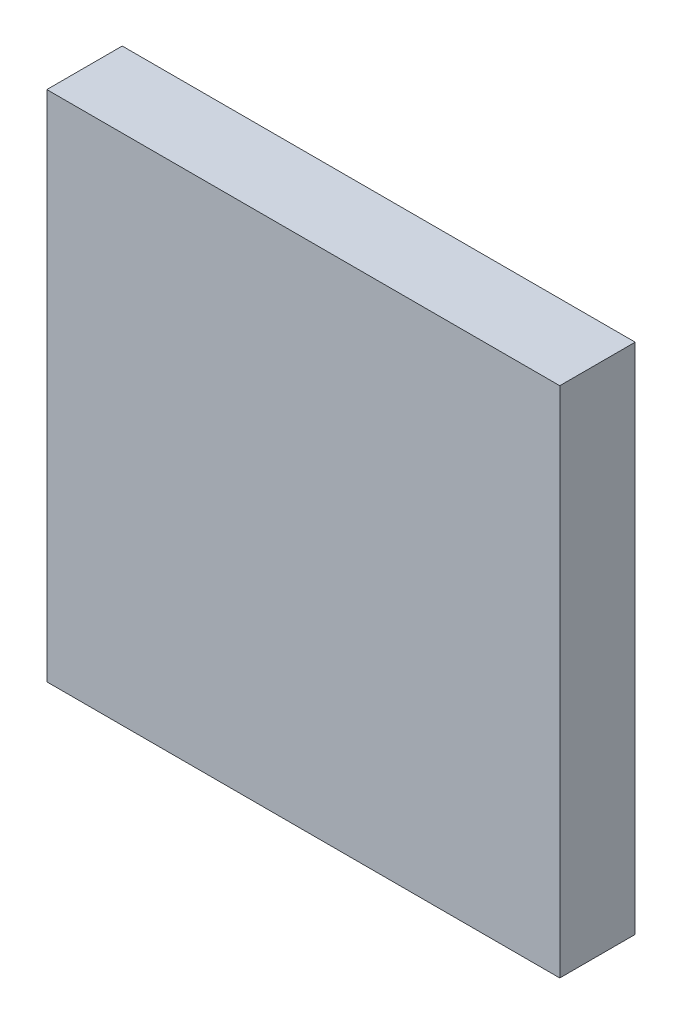
ISO-10303-21;
HEADER;
FILE_DESCRIPTION(('STEP AP214'),'2;1');
FILE_NAME('part.step','',(''),(''),'','','');
FILE_SCHEMA(('AUTOMOTIVE_DESIGN { 1 0 10303 214 1 1 1 1 }'));
ENDSEC;
DATA;
#1=APPLICATION_CONTEXT('core data for automotive mechanical design processes');
#2=APPLICATION_PROTOCOL_DEFINITION('international standard','automotive_design',2000,#1);
#3=PRODUCT_CONTEXT('',#1,'mechanical');
#4=PRODUCT('Part','Part','',(#3));
#5=PRODUCT_RELATED_PRODUCT_CATEGORY('part','',(#4));
#6=PRODUCT_DEFINITION_FORMATION('','',#4);
#7=PRODUCT_DEFINITION_CONTEXT('part definition',#1,'design');
#8=PRODUCT_DEFINITION('design','',#6,#7);
#9=PRODUCT_DEFINITION_SHAPE('','',#8);
#10=(LENGTH_UNIT() NAMED_UNIT(*) SI_UNIT(.MILLI.,.METRE.));
#11=(NAMED_UNIT(*) PLANE_ANGLE_UNIT() SI_UNIT($,.RADIAN.));
#12=(NAMED_UNIT(*) SI_UNIT($,.STERADIAN.) SOLID_ANGLE_UNIT());
#13=UNCERTAINTY_MEASURE_WITH_UNIT(LENGTH_MEASURE(1.E-05),#10,'distance_accuracy_value','');
#14=(GEOMETRIC_REPRESENTATION_CONTEXT(3) GLOBAL_UNCERTAINTY_ASSIGNED_CONTEXT((#13)) GLOBAL_UNIT_ASSIGNED_CONTEXT((#10,
#11,#12)) REPRESENTATION_CONTEXT('',''));
#15=CARTESIAN_POINT('',(0.,0.,0.));
#16=DIRECTION('',(0.,0.,1.));
#17=DIRECTION('',(1.,0.,0.));
#18=AXIS2_PLACEMENT_3D('',#15,#16,#17);
#19=CARTESIAN_POINT('',(17.,17.,5.));
#20=DIRECTION('',(-1.,0.,0.));
#21=DIRECTION('',(0.,0.,1.));
#22=AXIS2_PLACEMENT_3D('',#19,#20,#21);
#23=PLANE('',#22);
#24=DIRECTION('',(0.,1.,0.));
#25=VECTOR('',#24,1.);
#26=CARTESIAN_POINT('',(17.,17.,0.));
#27=LINE('',#26,#25);
#28=CARTESIAN_POINT('',(17.,-17.,0.));
#29=VERTEX_POINT('',#28);
#30=CARTESIAN_POINT('',(17.,17.,0.));
#31=VERTEX_POINT('',#30);
#32=EDGE_CURVE('E113',#29,#31,#27,.T.);
#33=ORIENTED_EDGE('',*,*,#32,.T.);
#34=DIRECTION('',(0.,0.,-1.));
#35=VECTOR('',#34,1.);
#36=CARTESIAN_POINT('',(17.,17.,5.));
#37=LINE('',#36,#35);
#38=CARTESIAN_POINT('',(17.,17.,5.));
#39=VERTEX_POINT('',#38);
#40=EDGE_CURVE('E11',#39,#31,#37,.T.);
#41=ORIENTED_EDGE('',*,*,#40,.F.);
#42=DIRECTION('',(0.,1.,0.));
#43=VECTOR('',#42,1.);
#44=CARTESIAN_POINT('',(17.,17.,5.));
#45=LINE('',#44,#43);
#46=CARTESIAN_POINT('',(17.,-17.,5.));
#47=VERTEX_POINT('',#46);
#48=EDGE_CURVE('E97',#47,#39,#45,.T.);
#49=ORIENTED_EDGE('',*,*,#48,.F.);
#50=DIRECTION('',(0.,0.,-1.));
#51=VECTOR('',#50,1.);
#52=CARTESIAN_POINT('',(17.,-17.,5.));
#53=LINE('',#52,#51);
#54=EDGE_CURVE('E109',#47,#29,#53,.T.);
#55=ORIENTED_EDGE('',*,*,#54,.T.);
#56=EDGE_LOOP('',(#33,#41,#49,#55));
#57=FACE_BOUND('',#56,.T.);
#58=ADVANCED_FACE('F45',(#57),#23,.F.);
#59=CARTESIAN_POINT('',(-17.,17.,5.));
#60=DIRECTION('',(0.,-1.,0.));
#61=DIRECTION('',(0.,0.,-1.));
#62=AXIS2_PLACEMENT_3D('',#59,#60,#61);
#63=PLANE('',#62);
#64=DIRECTION('',(-1.,0.,0.));
#65=VECTOR('',#64,1.);
#66=CARTESIAN_POINT('',(-17.,17.,0.));
#67=LINE('',#66,#65);
#68=CARTESIAN_POINT('',(-17.,17.,0.));
#69=VERTEX_POINT('',#68);
#70=EDGE_CURVE('E102',#31,#69,#67,.T.);
#71=ORIENTED_EDGE('',*,*,#70,.T.);
#72=DIRECTION('',(0.,0.,-1.));
#73=VECTOR('',#72,1.);
#74=CARTESIAN_POINT('',(-17.,17.,5.));
#75=LINE('',#74,#73);
#76=CARTESIAN_POINT('',(-17.,17.,5.));
#77=VERTEX_POINT('',#76);
#78=EDGE_CURVE('E54',#77,#69,#75,.T.);
#79=ORIENTED_EDGE('',*,*,#78,.F.);
#80=DIRECTION('',(-1.,0.,0.));
#81=VECTOR('',#80,1.);
#82=CARTESIAN_POINT('',(-17.,17.,5.));
#83=LINE('',#82,#81);
#84=EDGE_CURVE('E92',#39,#77,#83,.T.);
#85=ORIENTED_EDGE('',*,*,#84,.F.);
#86=ORIENTED_EDGE('',*,*,#40,.T.);
#87=EDGE_LOOP('',(#71,#79,#85,#86));
#88=FACE_BOUND('',#87,.T.);
#89=ADVANCED_FACE('F101',(#88),#63,.F.);
#90=CARTESIAN_POINT('',(-17.,17.,5.));
#91=DIRECTION('',(1.,0.,0.));
#92=DIRECTION('',(0.,1.,0.));
#93=AXIS2_PLACEMENT_3D('',#90,#91,#92);
#94=PLANE('',#93);
#95=DIRECTION('',(0.,-1.,0.));
#96=VECTOR('',#95,1.);
#97=CARTESIAN_POINT('',(-17.,17.,0.));
#98=LINE('',#97,#96);
#99=CARTESIAN_POINT('',(-17.,-17.,0.));
#100=VERTEX_POINT('',#99);
#101=EDGE_CURVE('E79',#69,#100,#98,.T.);
#102=ORIENTED_EDGE('',*,*,#101,.T.);
#103=DIRECTION('',(0.,0.,-1.));
#104=VECTOR('',#103,1.);
#105=CARTESIAN_POINT('',(-17.,-17.,5.));
#106=LINE('',#105,#104);
#107=CARTESIAN_POINT('',(-17.,-17.,5.));
#108=VERTEX_POINT('',#107);
#109=EDGE_CURVE('E104',#108,#100,#106,.T.);
#110=ORIENTED_EDGE('',*,*,#109,.F.);
#111=DIRECTION('',(0.,-1.,0.));
#112=VECTOR('',#111,1.);
#113=CARTESIAN_POINT('',(-17.,17.,5.));
#114=LINE('',#113,#112);
#115=EDGE_CURVE('E95',#77,#108,#114,.T.);
#116=ORIENTED_EDGE('',*,*,#115,.F.);
#117=ORIENTED_EDGE('',*,*,#78,.T.);
#118=EDGE_LOOP('',(#102,#110,#116,#117));
#119=FACE_BOUND('',#118,.T.);
#120=ADVANCED_FACE('F105',(#119),#94,.F.);
#121=CARTESIAN_POINT('',(-17.,-17.,5.));
#122=DIRECTION('',(0.,1.,0.));
#123=DIRECTION('',(0.,0.,1.));
#124=AXIS2_PLACEMENT_3D('',#121,#122,#123);
#125=PLANE('',#124);
#126=DIRECTION('',(1.,0.,0.));
#127=VECTOR('',#126,1.);
#128=CARTESIAN_POINT('',(-17.,-17.,0.));
#129=LINE('',#128,#127);
#130=EDGE_CURVE('E85',#100,#29,#129,.T.);
#131=ORIENTED_EDGE('',*,*,#130,.T.);
#132=ORIENTED_EDGE('',*,*,#54,.F.);
#133=DIRECTION('',(1.,0.,0.));
#134=VECTOR('',#133,1.);
#135=CARTESIAN_POINT('',(-17.,-17.,5.));
#136=LINE('',#135,#134);
#137=EDGE_CURVE('E62',#108,#47,#136,.T.);
#138=ORIENTED_EDGE('',*,*,#137,.F.);
#139=ORIENTED_EDGE('',*,*,#109,.T.);
#140=EDGE_LOOP('',(#131,#132,#138,#139));
#141=FACE_BOUND('',#140,.T.);
#142=ADVANCED_FACE('F126',(#141),#125,.F.);
#143=CARTESIAN_POINT('',(0.,0.,5.));
#144=DIRECTION('',(0.,0.,1.));
#145=DIRECTION('',(1.,0.,0.));
#146=AXIS2_PLACEMENT_3D('',#143,#144,#145);
#147=PLANE('',#146);
#148=ORIENTED_EDGE('',*,*,#48,.T.);
#149=ORIENTED_EDGE('',*,*,#84,.T.);
#150=ORIENTED_EDGE('',*,*,#115,.T.);
#151=ORIENTED_EDGE('',*,*,#137,.T.);
#152=EDGE_LOOP('',(#148,#149,#150,#151));
#153=FACE_BOUND('',#152,.T.);
#154=ADVANCED_FACE('F93',(#153),#147,.T.);
#155=CARTESIAN_POINT('',(0.,0.,0.));
#156=DIRECTION('',(0.,0.,1.));
#157=DIRECTION('',(1.,0.,0.));
#158=AXIS2_PLACEMENT_3D('',#155,#156,#157);
#159=PLANE('',#158);
#160=ORIENTED_EDGE('',*,*,#32,.F.);
#161=ORIENTED_EDGE('',*,*,#130,.F.);
#162=ORIENTED_EDGE('',*,*,#101,.F.);
#163=ORIENTED_EDGE('',*,*,#70,.F.);
#164=EDGE_LOOP('',(#160,#161,#162,#163));
#165=FACE_BOUND('',#164,.T.);
#166=ADVANCED_FACE('F129',(#165),#159,.F.);
#167=CLOSED_SHELL('',(#58,#89,#120,#142,#154,#166));
#168=MANIFOLD_SOLID_BREP('B2',#167);
#169=ADVANCED_BREP_SHAPE_REPRESENTATION('',(#18,#168),#14);
#170=SHAPE_DEFINITION_REPRESENTATION(#9,#169);
ENDSEC;
END-ISO-10303-21;
